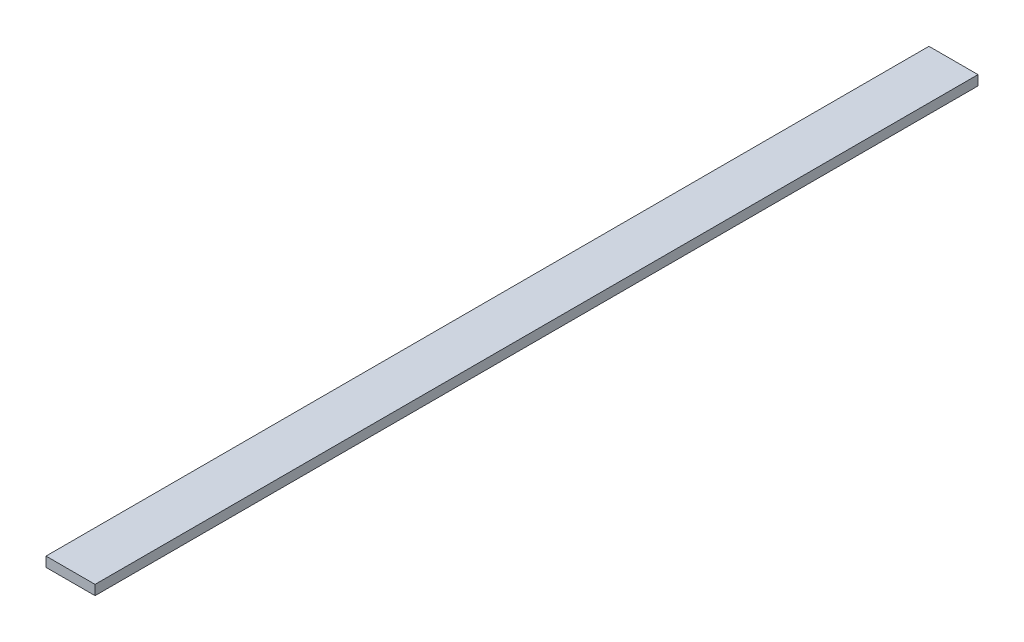
ISO-10303-21;
HEADER;
FILE_DESCRIPTION(('STEP AP214'),'2;1');
FILE_NAME('part.step','',(''),(''),'','','');
FILE_SCHEMA(('AUTOMOTIVE_DESIGN { 1 0 10303 214 1 1 1 1 }'));
ENDSEC;
DATA;
#1=APPLICATION_CONTEXT('core data for automotive mechanical design processes');
#2=APPLICATION_PROTOCOL_DEFINITION('international standard','automotive_design',2000,#1);
#3=PRODUCT_CONTEXT('',#1,'mechanical');
#4=PRODUCT('Part','Part','',(#3));
#5=PRODUCT_RELATED_PRODUCT_CATEGORY('part','',(#4));
#6=PRODUCT_DEFINITION_FORMATION('','',#4);
#7=PRODUCT_DEFINITION_CONTEXT('part definition',#1,'design');
#8=PRODUCT_DEFINITION('design','',#6,#7);
#9=PRODUCT_DEFINITION_SHAPE('','',#8);
#10=(LENGTH_UNIT() NAMED_UNIT(*) SI_UNIT(.MILLI.,.METRE.));
#11=(NAMED_UNIT(*) PLANE_ANGLE_UNIT() SI_UNIT($,.RADIAN.));
#12=(NAMED_UNIT(*) SI_UNIT($,.STERADIAN.) SOLID_ANGLE_UNIT());
#13=UNCERTAINTY_MEASURE_WITH_UNIT(LENGTH_MEASURE(1.E-05),#10,'distance_accuracy_value','');
#14=(GEOMETRIC_REPRESENTATION_CONTEXT(3) GLOBAL_UNCERTAINTY_ASSIGNED_CONTEXT((#13)) GLOBAL_UNIT_ASSIGNED_CONTEXT((#10,
#11,#12)) REPRESENTATION_CONTEXT('',''));
#15=CARTESIAN_POINT('',(0.,0.,0.));
#16=DIRECTION('',(0.,0.,1.));
#17=DIRECTION('',(1.,0.,0.));
#18=AXIS2_PLACEMENT_3D('',#15,#16,#17);
#19=CARTESIAN_POINT('',(0.,0.,180.));
#20=DIRECTION('',(1.,0.,0.));
#21=DIRECTION('',(0.,0.,-1.));
#22=AXIS2_PLACEMENT_3D('',#19,#20,#21);
#23=PLANE('',#22);
#24=DIRECTION('',(0.,-1.,0.));
#25=VECTOR('',#24,1.);
#26=CARTESIAN_POINT('',(0.,0.,0.));
#27=LINE('',#26,#25);
#28=CARTESIAN_POINT('',(0.,2.,0.));
#29=VERTEX_POINT('',#28);
#30=CARTESIAN_POINT('',(0.,0.,0.));
#31=VERTEX_POINT('',#30);
#32=EDGE_CURVE('E76',#29,#31,#27,.T.);
#33=ORIENTED_EDGE('',*,*,#32,.T.);
#34=DIRECTION('',(0.,0.,-1.));
#35=VECTOR('',#34,1.);
#36=CARTESIAN_POINT('',(0.,0.,180.));
#37=LINE('',#36,#35);
#38=CARTESIAN_POINT('',(0.,0.,180.));
#39=VERTEX_POINT('',#38);
#40=EDGE_CURVE('E11',#39,#31,#37,.T.);
#41=ORIENTED_EDGE('',*,*,#40,.F.);
#42=DIRECTION('',(0.,-1.,0.));
#43=VECTOR('',#42,1.);
#44=CARTESIAN_POINT('',(0.,0.,180.));
#45=LINE('',#44,#43);
#46=CARTESIAN_POINT('',(0.,2.,180.));
#47=VERTEX_POINT('',#46);
#48=EDGE_CURVE('E94',#47,#39,#45,.T.);
#49=ORIENTED_EDGE('',*,*,#48,.F.);
#50=DIRECTION('',(0.,0.,-1.));
#51=VECTOR('',#50,1.);
#52=CARTESIAN_POINT('',(0.,2.,180.));
#53=LINE('',#52,#51);
#54=EDGE_CURVE('E88',#47,#29,#53,.T.);
#55=ORIENTED_EDGE('',*,*,#54,.T.);
#56=EDGE_LOOP('',(#33,#41,#49,#55));
#57=FACE_BOUND('',#56,.T.);
#58=ADVANCED_FACE('F32',(#57),#23,.F.);
#59=CARTESIAN_POINT('',(0.,0.,180.));
#60=DIRECTION('',(0.,1.,0.));
#61=DIRECTION('',(0.,0.,1.));
#62=AXIS2_PLACEMENT_3D('',#59,#60,#61);
#63=PLANE('',#62);
#64=DIRECTION('',(1.,0.,0.));
#65=VECTOR('',#64,1.);
#66=CARTESIAN_POINT('',(0.,0.,0.));
#67=LINE('',#66,#65);
#68=CARTESIAN_POINT('',(10.,0.,0.));
#69=VERTEX_POINT('',#68);
#70=EDGE_CURVE('E72',#31,#69,#67,.T.);
#71=ORIENTED_EDGE('',*,*,#70,.T.);
#72=DIRECTION('',(0.,0.,-1.));
#73=VECTOR('',#72,1.);
#74=CARTESIAN_POINT('',(10.,0.,180.));
#75=LINE('',#74,#73);
#76=CARTESIAN_POINT('',(10.,0.,180.));
#77=VERTEX_POINT('',#76);
#78=EDGE_CURVE('E39',#77,#69,#75,.T.);
#79=ORIENTED_EDGE('',*,*,#78,.F.);
#80=DIRECTION('',(1.,0.,0.));
#81=VECTOR('',#80,1.);
#82=CARTESIAN_POINT('',(0.,0.,180.));
#83=LINE('',#82,#81);
#84=EDGE_CURVE('E84',#39,#77,#83,.T.);
#85=ORIENTED_EDGE('',*,*,#84,.F.);
#86=ORIENTED_EDGE('',*,*,#40,.T.);
#87=EDGE_LOOP('',(#71,#79,#85,#86));
#88=FACE_BOUND('',#87,.T.);
#89=ADVANCED_FACE('F83',(#88),#63,.F.);
#90=CARTESIAN_POINT('',(10.,0.,180.));
#91=DIRECTION('',(-1.,0.,0.));
#92=DIRECTION('',(0.,0.,1.));
#93=AXIS2_PLACEMENT_3D('',#90,#91,#92);
#94=PLANE('',#93);
#95=DIRECTION('',(0.,1.,0.));
#96=VECTOR('',#95,1.);
#97=CARTESIAN_POINT('',(10.,0.,0.));
#98=LINE('',#97,#96);
#99=CARTESIAN_POINT('',(10.,2.,0.));
#100=VERTEX_POINT('',#99);
#101=EDGE_CURVE('E77',#69,#100,#98,.T.);
#102=ORIENTED_EDGE('',*,*,#101,.T.);
#103=DIRECTION('',(0.,0.,-1.));
#104=VECTOR('',#103,1.);
#105=CARTESIAN_POINT('',(10.,2.,180.));
#106=LINE('',#105,#104);
#107=CARTESIAN_POINT('',(10.,2.,180.));
#108=VERTEX_POINT('',#107);
#109=EDGE_CURVE('E100',#108,#100,#106,.T.);
#110=ORIENTED_EDGE('',*,*,#109,.F.);
#111=DIRECTION('',(0.,1.,0.));
#112=VECTOR('',#111,1.);
#113=CARTESIAN_POINT('',(10.,0.,180.));
#114=LINE('',#113,#112);
#115=EDGE_CURVE('E51',#77,#108,#114,.T.);
#116=ORIENTED_EDGE('',*,*,#115,.F.);
#117=ORIENTED_EDGE('',*,*,#78,.T.);
#118=EDGE_LOOP('',(#102,#110,#116,#117));
#119=FACE_BOUND('',#118,.T.);
#120=ADVANCED_FACE('F103',(#119),#94,.F.);
#121=CARTESIAN_POINT('',(0.,2.,180.));
#122=DIRECTION('',(0.,-1.,0.));
#123=DIRECTION('',(0.,0.,-1.));
#124=AXIS2_PLACEMENT_3D('',#121,#122,#123);
#125=PLANE('',#124);
#126=DIRECTION('',(-1.,0.,0.));
#127=VECTOR('',#126,1.);
#128=CARTESIAN_POINT('',(0.,2.,0.));
#129=LINE('',#128,#127);
#130=EDGE_CURVE('E92',#100,#29,#129,.T.);
#131=ORIENTED_EDGE('',*,*,#130,.T.);
#132=ORIENTED_EDGE('',*,*,#54,.F.);
#133=DIRECTION('',(-1.,0.,0.));
#134=VECTOR('',#133,1.);
#135=CARTESIAN_POINT('',(0.,2.,180.));
#136=LINE('',#135,#134);
#137=EDGE_CURVE('E46',#108,#47,#136,.T.);
#138=ORIENTED_EDGE('',*,*,#137,.F.);
#139=ORIENTED_EDGE('',*,*,#109,.T.);
#140=EDGE_LOOP('',(#131,#132,#138,#139));
#141=FACE_BOUND('',#140,.T.);
#142=ADVANCED_FACE('F105',(#141),#125,.F.);
#143=CARTESIAN_POINT('',(0.,2.,180.));
#144=DIRECTION('',(0.,0.,-1.));
#145=DIRECTION('',(-1.,0.,0.));
#146=AXIS2_PLACEMENT_3D('',#143,#144,#145);
#147=PLANE('',#146);
#148=ORIENTED_EDGE('',*,*,#48,.T.);
#149=ORIENTED_EDGE('',*,*,#84,.T.);
#150=ORIENTED_EDGE('',*,*,#115,.T.);
#151=ORIENTED_EDGE('',*,*,#137,.T.);
#152=EDGE_LOOP('',(#148,#149,#150,#151));
#153=FACE_BOUND('',#152,.T.);
#154=ADVANCED_FACE('F106',(#153),#147,.F.);
#155=CARTESIAN_POINT('',(0.,2.,0.));
#156=DIRECTION('',(0.,0.,-1.));
#157=DIRECTION('',(-1.,0.,0.));
#158=AXIS2_PLACEMENT_3D('',#155,#156,#157);
#159=PLANE('',#158);
#160=ORIENTED_EDGE('',*,*,#32,.F.);
#161=ORIENTED_EDGE('',*,*,#130,.F.);
#162=ORIENTED_EDGE('',*,*,#101,.F.);
#163=ORIENTED_EDGE('',*,*,#70,.F.);
#164=EDGE_LOOP('',(#160,#161,#162,#163));
#165=FACE_BOUND('',#164,.T.);
#166=ADVANCED_FACE('F73',(#165),#159,.T.);
#167=CLOSED_SHELL('',(#58,#89,#120,#142,#154,#166));
#168=MANIFOLD_SOLID_BREP('B2',#167);
#169=ADVANCED_BREP_SHAPE_REPRESENTATION('',(#18,#168),#14);
#170=SHAPE_DEFINITION_REPRESENTATION(#9,#169);
ENDSEC;
END-ISO-10303-21;
